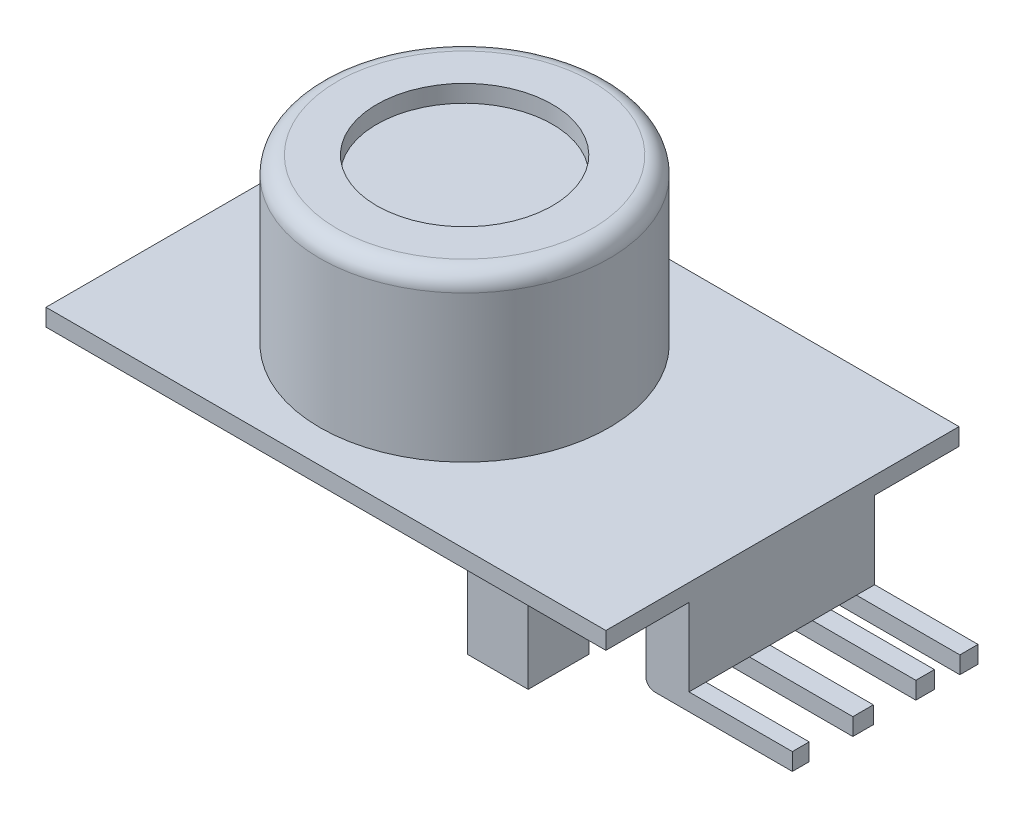
ISO-10303-21;
HEADER;
FILE_DESCRIPTION(('STEP AP214'),'2;1');
FILE_NAME('part.step','',(''),(''),'','','');
FILE_SCHEMA(('AUTOMOTIVE_DESIGN { 1 0 10303 214 1 1 1 1 }'));
ENDSEC;
DATA;
#1=APPLICATION_CONTEXT('core data for automotive mechanical design processes');
#2=APPLICATION_PROTOCOL_DEFINITION('international standard','automotive_design',2000,#1);
#3=PRODUCT_CONTEXT('',#1,'mechanical');
#4=PRODUCT('Part','Part','',(#3));
#5=PRODUCT_RELATED_PRODUCT_CATEGORY('part','',(#4));
#6=PRODUCT_DEFINITION_FORMATION('','',#4);
#7=PRODUCT_DEFINITION_CONTEXT('part definition',#1,'design');
#8=PRODUCT_DEFINITION('design','',#6,#7);
#9=PRODUCT_DEFINITION_SHAPE('','',#8);
#10=(LENGTH_UNIT() NAMED_UNIT(*) SI_UNIT(.MILLI.,.METRE.));
#11=(NAMED_UNIT(*) PLANE_ANGLE_UNIT() SI_UNIT($,.RADIAN.));
#12=(NAMED_UNIT(*) SI_UNIT($,.STERADIAN.) SOLID_ANGLE_UNIT());
#13=UNCERTAINTY_MEASURE_WITH_UNIT(LENGTH_MEASURE(1.E-05),#10,'distance_accuracy_value','');
#14=(GEOMETRIC_REPRESENTATION_CONTEXT(3) GLOBAL_UNCERTAINTY_ASSIGNED_CONTEXT((#13)) GLOBAL_UNIT_ASSIGNED_CONTEXT((#10,
#11,#12)) REPRESENTATION_CONTEXT('',''));
#15=CARTESIAN_POINT('',(0.,0.,0.));
#16=DIRECTION('',(0.,0.,1.));
#17=DIRECTION('',(1.,0.,0.));
#18=AXIS2_PLACEMENT_3D('',#15,#16,#17);
#19=CARTESIAN_POINT('',(30.,-5.5,-4.82477315597407));
#20=DIRECTION('',(1.,0.,0.));
#21=DIRECTION('',(0.,0.,-1.));
#22=AXIS2_PLACEMENT_3D('',#19,#20,#21);
#23=PLANE('',#22);
#24=DIRECTION('',(0.,1.,0.));
#25=VECTOR('',#24,1.);
#26=CARTESIAN_POINT('',(30.,-5.5,-5.80335780313983));
#27=LINE('',#26,#25);
#28=CARTESIAN_POINT('',(30.,-5.,-5.80335780313983));
#29=VERTEX_POINT('',#28);
#30=CARTESIAN_POINT('',(30.,-4.5,-5.80335780313983));
#31=VERTEX_POINT('',#30);
#32=EDGE_CURVE('E449',#29,#31,#27,.T.);
#33=ORIENTED_EDGE('',*,*,#32,.F.);
#34=DIRECTION('',(0.,0.,-1.));
#35=VECTOR('',#34,1.);
#36=CARTESIAN_POINT('',(30.,-5.,-4.82477315597407));
#37=LINE('',#36,#35);
#38=CARTESIAN_POINT('',(30.,-5.,-4.82477315597407));
#39=VERTEX_POINT('',#38);
#40=EDGE_CURVE('E372',#29,#39,#37,.F.);
#41=ORIENTED_EDGE('',*,*,#40,.T.);
#42=DIRECTION('',(0.,1.,0.));
#43=VECTOR('',#42,1.);
#44=CARTESIAN_POINT('',(30.,-5.5,-4.82477315597407));
#45=LINE('',#44,#43);
#46=CARTESIAN_POINT('',(30.,0.,-4.82477315597407));
#47=VERTEX_POINT('',#46);
#48=EDGE_CURVE('E316',#39,#47,#45,.T.);
#49=ORIENTED_EDGE('',*,*,#48,.T.);
#50=DIRECTION('',(0.,0.,-1.));
#51=VECTOR('',#50,1.);
#52=CARTESIAN_POINT('',(30.,0.,-4.82477315597407));
#53=LINE('',#52,#51);
#54=CARTESIAN_POINT('',(30.,0.,-15.6016245856563));
#55=VERTEX_POINT('',#54);
#56=EDGE_CURVE('E308',#47,#55,#53,.T.);
#57=ORIENTED_EDGE('',*,*,#56,.T.);
#58=DIRECTION('',(0.,1.,0.));
#59=VECTOR('',#58,1.);
#60=CARTESIAN_POINT('',(30.,-5.5,-15.6016245856563));
#61=LINE('',#60,#59);
#62=CARTESIAN_POINT('',(30.,-5.,-15.6016245856563));
#63=VERTEX_POINT('',#62);
#64=EDGE_CURVE('E314',#63,#55,#61,.T.);
#65=ORIENTED_EDGE('',*,*,#64,.F.);
#66=DIRECTION('',(0.,0.,-1.));
#67=VECTOR('',#66,1.);
#68=CARTESIAN_POINT('',(30.,-5.,-4.82477315597407));
#69=LINE('',#68,#67);
#70=CARTESIAN_POINT('',(30.,-5.,-14.5483695910362));
#71=VERTEX_POINT('',#70);
#72=EDGE_CURVE('E366',#63,#71,#69,.F.);
#73=ORIENTED_EDGE('',*,*,#72,.T.);
#74=DIRECTION('',(0.,1.,0.));
#75=VECTOR('',#74,1.);
#76=CARTESIAN_POINT('',(30.,-5.5,-14.5483695910362));
#77=LINE('',#76,#75);
#78=CARTESIAN_POINT('',(30.,-4.5,-14.5483695910362));
#79=VERTEX_POINT('',#78);
#80=EDGE_CURVE('E423',#71,#79,#77,.T.);
#81=ORIENTED_EDGE('',*,*,#80,.T.);
#82=DIRECTION('',(0.,0.,1.));
#83=VECTOR('',#82,1.);
#84=CARTESIAN_POINT('',(30.,-4.5,-4.82477315597407));
#85=LINE('',#84,#83);
#86=CARTESIAN_POINT('',(30.,-4.5,-13.0725111784693));
#87=VERTEX_POINT('',#86);
#88=EDGE_CURVE('E425',#79,#87,#85,.T.);
#89=ORIENTED_EDGE('',*,*,#88,.T.);
#90=DIRECTION('',(0.,-1.,0.));
#91=VECTOR('',#90,1.);
#92=CARTESIAN_POINT('',(30.,-5.5,-13.0725111784693));
#93=LINE('',#92,#91);
#94=CARTESIAN_POINT('',(30.,-5.,-13.0725111784693));
#95=VERTEX_POINT('',#94);
#96=EDGE_CURVE('E420',#87,#95,#93,.T.);
#97=ORIENTED_EDGE('',*,*,#96,.T.);
#98=DIRECTION('',(0.,0.,-1.));
#99=VECTOR('',#98,1.);
#100=CARTESIAN_POINT('',(30.,-5.,-4.82477315597407));
#101=LINE('',#100,#99);
#102=CARTESIAN_POINT('',(30.,-5.,-11.9931520409204));
#103=VERTEX_POINT('',#102);
#104=EDGE_CURVE('E368',#95,#103,#101,.F.);
#105=ORIENTED_EDGE('',*,*,#104,.T.);
#106=DIRECTION('',(0.,-1.,0.));
#107=VECTOR('',#106,1.);
#108=CARTESIAN_POINT('',(30.,-5.5,-11.9931520409204));
#109=LINE('',#108,#107);
#110=CARTESIAN_POINT('',(30.,-4.5,-11.9931520409204));
#111=VERTEX_POINT('',#110);
#112=EDGE_CURVE('E434',#111,#103,#109,.T.);
#113=ORIENTED_EDGE('',*,*,#112,.F.);
#114=DIRECTION('',(0.,0.,1.));
#115=VECTOR('',#114,1.);
#116=CARTESIAN_POINT('',(30.,-4.5,-4.82477315597407));
#117=LINE('',#116,#115);
#118=CARTESIAN_POINT('',(30.,-4.5,-9.52604544080855));
#119=VERTEX_POINT('',#118);
#120=EDGE_CURVE('E437',#111,#119,#117,.T.);
#121=ORIENTED_EDGE('',*,*,#120,.T.);
#122=DIRECTION('',(0.,-1.,0.));
#123=VECTOR('',#122,1.);
#124=CARTESIAN_POINT('',(30.,-5.5,-9.52604544080855));
#125=LINE('',#124,#123);
#126=CARTESIAN_POINT('',(30.,-5.,-9.52604544080855));
#127=VERTEX_POINT('',#126);
#128=EDGE_CURVE('E431',#119,#127,#125,.T.);
#129=ORIENTED_EDGE('',*,*,#128,.T.);
#130=DIRECTION('',(0.,0.,-1.));
#131=VECTOR('',#130,1.);
#132=CARTESIAN_POINT('',(30.,-5.,-4.82477315597407));
#133=LINE('',#132,#131);
#134=CARTESIAN_POINT('',(30.,-5.,-8.33654761575464));
#135=VERTEX_POINT('',#134);
#136=EDGE_CURVE('E370',#127,#135,#133,.F.);
#137=ORIENTED_EDGE('',*,*,#136,.T.);
#138=DIRECTION('',(0.,-1.,0.));
#139=VECTOR('',#138,1.);
#140=CARTESIAN_POINT('',(30.,-5.5,-8.33654761575464));
#141=LINE('',#140,#139);
#142=CARTESIAN_POINT('',(30.,-4.5,-8.33654761575464));
#143=VERTEX_POINT('',#142);
#144=EDGE_CURVE('E451',#143,#135,#141,.T.);
#145=ORIENTED_EDGE('',*,*,#144,.F.);
#146=DIRECTION('',(0.,0.,1.));
#147=VECTOR('',#146,1.);
#148=CARTESIAN_POINT('',(30.,-4.5,-4.82477315597407));
#149=LINE('',#148,#147);
#150=EDGE_CURVE('E443',#143,#31,#149,.T.);
#151=ORIENTED_EDGE('',*,*,#150,.T.);
#152=EDGE_LOOP('',(#33,#41,#49,#57,#65,#73,#81,#89,#97,#105,#113,#121,#129,#137,#145,#151));
#153=FACE_BOUND('',#152,.T.);
#154=ADVANCED_FACE('F33',(#153),#23,.F.);
#155=CARTESIAN_POINT('',(0.,-5.5,0.));
#156=DIRECTION('',(0.,1.,0.));
#157=DIRECTION('',(0.,0.,1.));
#158=AXIS2_PLACEMENT_3D('',#155,#156,#157);
#159=PLANE('',#158);
#160=DIRECTION('',(1.,0.,0.));
#161=VECTOR('',#160,1.);
#162=CARTESIAN_POINT('',(26.5,-5.5,-8.33654761575464));
#163=LINE('',#162,#161);
#164=CARTESIAN_POINT('',(30.5,-5.5,-8.33654761575464));
#165=VERTEX_POINT('',#164);
#166=CARTESIAN_POINT('',(38.5,-5.5,-8.33654761575464));
#167=VERTEX_POINT('',#166);
#168=EDGE_CURVE('E254',#165,#167,#163,.T.);
#169=ORIENTED_EDGE('',*,*,#168,.F.);
#170=DIRECTION('',(0.,0.,-1.));
#171=VECTOR('',#170,1.);
#172=CARTESIAN_POINT('',(30.5,-5.5,0.));
#173=LINE('',#172,#171);
#174=CARTESIAN_POINT('',(30.5,-5.5,-9.52604544080855));
#175=VERTEX_POINT('',#174);
#176=EDGE_CURVE('E376',#165,#175,#173,.T.);
#177=ORIENTED_EDGE('',*,*,#176,.T.);
#178=DIRECTION('',(1.,0.,0.));
#179=VECTOR('',#178,1.);
#180=CARTESIAN_POINT('',(26.5,-5.5,-9.52604544080855));
#181=LINE('',#180,#179);
#182=CARTESIAN_POINT('',(38.5,-5.5,-9.52604544080855));
#183=VERTEX_POINT('',#182);
#184=EDGE_CURVE('E522',#175,#183,#181,.T.);
#185=ORIENTED_EDGE('',*,*,#184,.T.);
#186=DIRECTION('',(0.,0.,-1.));
#187=VECTOR('',#186,1.);
#188=CARTESIAN_POINT('',(38.5,-5.5,-4.82477315597407));
#189=LINE('',#188,#187);
#190=EDGE_CURVE('E491',#167,#183,#189,.T.);
#191=ORIENTED_EDGE('',*,*,#190,.F.);
#192=EDGE_LOOP('',(#169,#177,#185,#191));
#193=FACE_BOUND('',#192,.T.);
#194=ADVANCED_FACE('F577',(#193),#159,.F.);
#195=DIRECTION('',(-1.,0.,0.));
#196=VECTOR('',#195,1.);
#197=CARTESIAN_POINT('',(32.5,-5.5,-4.82477315597407));
#198=LINE('',#197,#196);
#199=CARTESIAN_POINT('',(38.5,-5.5,-4.82477315597407));
#200=VERTEX_POINT('',#199);
#201=CARTESIAN_POINT('',(30.5,-5.5,-4.82477315597407));
#202=VERTEX_POINT('',#201);
#203=EDGE_CURVE('E299',#200,#202,#198,.T.);
#204=ORIENTED_EDGE('',*,*,#203,.T.);
#205=DIRECTION('',(0.,0.,-1.));
#206=VECTOR('',#205,1.);
#207=CARTESIAN_POINT('',(30.5,-5.5,0.));
#208=LINE('',#207,#206);
#209=CARTESIAN_POINT('',(30.5,-5.5,-5.80335780313983));
#210=VERTEX_POINT('',#209);
#211=EDGE_CURVE('E361',#202,#210,#208,.T.);
#212=ORIENTED_EDGE('',*,*,#211,.T.);
#213=DIRECTION('',(1.,0.,0.));
#214=VECTOR('',#213,1.);
#215=CARTESIAN_POINT('',(26.5,-5.5,-5.80335780313983));
#216=LINE('',#215,#214);
#217=CARTESIAN_POINT('',(38.5,-5.5,-5.80335780313983));
#218=VERTEX_POINT('',#217);
#219=EDGE_CURVE('E533',#210,#218,#216,.T.);
#220=ORIENTED_EDGE('',*,*,#219,.T.);
#221=EDGE_CURVE('E489',#200,#218,#189,.T.);
#222=ORIENTED_EDGE('',*,*,#221,.F.);
#223=EDGE_LOOP('',(#204,#212,#220,#222));
#224=FACE_BOUND('',#223,.T.);
#225=ADVANCED_FACE('F554',(#224),#159,.F.);
#226=DIRECTION('',(1.,0.,0.));
#227=VECTOR('',#226,1.);
#228=CARTESIAN_POINT('',(26.5,-5.5,-11.9931520409204));
#229=LINE('',#228,#227);
#230=CARTESIAN_POINT('',(30.5,-5.5,-11.9931520409204));
#231=VERTEX_POINT('',#230);
#232=CARTESIAN_POINT('',(38.5,-5.5,-11.9931520409204));
#233=VERTEX_POINT('',#232);
#234=EDGE_CURVE('E510',#231,#233,#229,.T.);
#235=ORIENTED_EDGE('',*,*,#234,.F.);
#236=DIRECTION('',(0.,0.,-1.));
#237=VECTOR('',#236,1.);
#238=CARTESIAN_POINT('',(30.5,-5.5,0.));
#239=LINE('',#238,#237);
#240=CARTESIAN_POINT('',(30.5,-5.5,-13.0725111784693));
#241=VERTEX_POINT('',#240);
#242=EDGE_CURVE('E383',#231,#241,#239,.T.);
#243=ORIENTED_EDGE('',*,*,#242,.T.);
#244=DIRECTION('',(1.,0.,0.));
#245=VECTOR('',#244,1.);
#246=CARTESIAN_POINT('',(26.5,-5.5,-13.0725111784693));
#247=LINE('',#246,#245);
#248=CARTESIAN_POINT('',(38.5,-5.5,-13.0725111784693));
#249=VERTEX_POINT('',#248);
#250=EDGE_CURVE('E408',#241,#249,#247,.T.);
#251=ORIENTED_EDGE('',*,*,#250,.T.);
#252=EDGE_CURVE('E495',#233,#249,#189,.T.);
#253=ORIENTED_EDGE('',*,*,#252,.F.);
#254=EDGE_LOOP('',(#235,#243,#251,#253));
#255=FACE_BOUND('',#254,.T.);
#256=ADVANCED_FACE('F509',(#255),#159,.F.);
#257=DIRECTION('',(1.,0.,0.));
#258=VECTOR('',#257,1.);
#259=CARTESIAN_POINT('',(26.5,-5.5,-14.5483695910362));
#260=LINE('',#259,#258);
#261=CARTESIAN_POINT('',(30.5,-5.5,-14.5483695910362));
#262=VERTEX_POINT('',#261);
#263=CARTESIAN_POINT('',(38.5,-5.5,-14.5483695910362));
#264=VERTEX_POINT('',#263);
#265=EDGE_CURVE('E404',#262,#264,#260,.T.);
#266=ORIENTED_EDGE('',*,*,#265,.F.);
#267=DIRECTION('',(0.,0.,-1.));
#268=VECTOR('',#267,1.);
#269=CARTESIAN_POINT('',(30.5,-5.5,0.));
#270=LINE('',#269,#268);
#271=CARTESIAN_POINT('',(30.5,-5.5,-15.6016245856563));
#272=VERTEX_POINT('',#271);
#273=EDGE_CURVE('E390',#262,#272,#270,.T.);
#274=ORIENTED_EDGE('',*,*,#273,.T.);
#275=DIRECTION('',(1.,0.,0.));
#276=VECTOR('',#275,1.);
#277=CARTESIAN_POINT('',(32.5,-5.5,-15.6016245856563));
#278=LINE('',#277,#276);
#279=CARTESIAN_POINT('',(38.5,-5.5,-15.6016245856563));
#280=VERTEX_POINT('',#279);
#281=EDGE_CURVE('E302',#272,#280,#278,.T.);
#282=ORIENTED_EDGE('',*,*,#281,.T.);
#283=EDGE_CURVE('E405',#264,#280,#189,.T.);
#284=ORIENTED_EDGE('',*,*,#283,.F.);
#285=EDGE_LOOP('',(#266,#274,#282,#284));
#286=FACE_BOUND('',#285,.T.);
#287=ADVANCED_FACE('F401',(#286),#159,.F.);
#288=CARTESIAN_POINT('',(38.5,-4.5,-4.82477315597407));
#289=DIRECTION('',(0.,-1.,0.));
#290=DIRECTION('',(0.,0.,-1.));
#291=AXIS2_PLACEMENT_3D('',#288,#289,#290);
#292=PLANE('',#291);
#293=DIRECTION('',(1.,0.,0.));
#294=VECTOR('',#293,1.);
#295=CARTESIAN_POINT('',(26.5,-4.5,-8.33654761575464));
#296=LINE('',#295,#294);
#297=CARTESIAN_POINT('',(32.5,-4.5,-8.33654761575464));
#298=VERTEX_POINT('',#297);
#299=CARTESIAN_POINT('',(38.5,-4.5,-8.33654761575464));
#300=VERTEX_POINT('',#299);
#301=EDGE_CURVE('E251',#298,#300,#296,.T.);
#302=ORIENTED_EDGE('',*,*,#301,.T.);
#303=DIRECTION('',(0.,0.,1.));
#304=VECTOR('',#303,1.);
#305=CARTESIAN_POINT('',(38.5,-4.5,-4.82477315597407));
#306=LINE('',#305,#304);
#307=CARTESIAN_POINT('',(38.5,-4.5,-9.52604544080855));
#308=VERTEX_POINT('',#307);
#309=EDGE_CURVE('E267',#308,#300,#306,.T.);
#310=ORIENTED_EDGE('',*,*,#309,.F.);
#311=DIRECTION('',(1.,0.,0.));
#312=VECTOR('',#311,1.);
#313=CARTESIAN_POINT('',(26.5,-4.5,-9.52604544080855));
#314=LINE('',#313,#312);
#315=CARTESIAN_POINT('',(32.5,-4.5,-9.52604544080855));
#316=VERTEX_POINT('',#315);
#317=EDGE_CURVE('E519',#316,#308,#314,.T.);
#318=ORIENTED_EDGE('',*,*,#317,.F.);
#319=DIRECTION('',(0.,0.,1.));
#320=VECTOR('',#319,1.);
#321=CARTESIAN_POINT('',(32.5,-4.5,-4.82477315597407));
#322=LINE('',#321,#320);
#323=EDGE_CURVE('E269',#316,#298,#322,.T.);
#324=ORIENTED_EDGE('',*,*,#323,.T.);
#325=EDGE_LOOP('',(#302,#310,#318,#324));
#326=FACE_BOUND('',#325,.T.);
#327=ADVANCED_FACE('F265',(#326),#292,.F.);
#328=DIRECTION('',(1.,0.,0.));
#329=VECTOR('',#328,1.);
#330=CARTESIAN_POINT('',(26.5,-4.5,-5.80335780313983));
#331=LINE('',#330,#329);
#332=CARTESIAN_POINT('',(32.5,-4.5,-5.80335780313983));
#333=VERTEX_POINT('',#332);
#334=CARTESIAN_POINT('',(38.5,-4.5,-5.80335780313983));
#335=VERTEX_POINT('',#334);
#336=EDGE_CURVE('E530',#333,#335,#331,.T.);
#337=ORIENTED_EDGE('',*,*,#336,.F.);
#338=CARTESIAN_POINT('',(32.5,-4.5,-4.82477315597407));
#339=VERTEX_POINT('',#338);
#340=EDGE_CURVE('E292',#333,#339,#322,.T.);
#341=ORIENTED_EDGE('',*,*,#340,.T.);
#342=DIRECTION('',(-1.,0.,0.));
#343=VECTOR('',#342,1.);
#344=CARTESIAN_POINT('',(38.5,-4.5,-4.82477315597407));
#345=LINE('',#344,#343);
#346=CARTESIAN_POINT('',(38.5,-4.5,-4.82477315597407));
#347=VERTEX_POINT('',#346);
#348=EDGE_CURVE('E285',#347,#339,#345,.T.);
#349=ORIENTED_EDGE('',*,*,#348,.F.);
#350=EDGE_CURVE('E277',#335,#347,#306,.T.);
#351=ORIENTED_EDGE('',*,*,#350,.F.);
#352=EDGE_LOOP('',(#337,#341,#349,#351));
#353=FACE_BOUND('',#352,.T.);
#354=ADVANCED_FACE('F544',(#353),#292,.F.);
#355=DIRECTION('',(1.,0.,0.));
#356=VECTOR('',#355,1.);
#357=CARTESIAN_POINT('',(26.5,-4.5,-11.9931520409204));
#358=LINE('',#357,#356);
#359=CARTESIAN_POINT('',(32.5,-4.5,-11.9931520409204));
#360=VERTEX_POINT('',#359);
#361=CARTESIAN_POINT('',(38.5,-4.5,-11.9931520409204));
#362=VERTEX_POINT('',#361);
#363=EDGE_CURVE('E525',#360,#362,#358,.T.);
#364=ORIENTED_EDGE('',*,*,#363,.T.);
#365=CARTESIAN_POINT('',(38.5,-4.5,-13.0725111784693));
#366=VERTEX_POINT('',#365);
#367=EDGE_CURVE('E276',#366,#362,#306,.T.);
#368=ORIENTED_EDGE('',*,*,#367,.F.);
#369=DIRECTION('',(1.,0.,0.));
#370=VECTOR('',#369,1.);
#371=CARTESIAN_POINT('',(26.5,-4.5,-13.0725111784693));
#372=LINE('',#371,#370);
#373=CARTESIAN_POINT('',(32.5,-4.5,-13.0725111784693));
#374=VERTEX_POINT('',#373);
#375=EDGE_CURVE('E417',#374,#366,#372,.T.);
#376=ORIENTED_EDGE('',*,*,#375,.F.);
#377=EDGE_CURVE('E291',#374,#360,#322,.T.);
#378=ORIENTED_EDGE('',*,*,#377,.T.);
#379=EDGE_LOOP('',(#364,#368,#376,#378));
#380=FACE_BOUND('',#379,.T.);
#381=ADVANCED_FACE('F676',(#380),#292,.F.);
#382=CARTESIAN_POINT('',(32.5,-4.5,-15.6016245856563));
#383=VERTEX_POINT('',#382);
#384=CARTESIAN_POINT('',(32.5,-4.5,-14.5483695910362));
#385=VERTEX_POINT('',#384);
#386=EDGE_CURVE('E287',#383,#385,#322,.T.);
#387=ORIENTED_EDGE('',*,*,#386,.T.);
#388=DIRECTION('',(1.,0.,0.));
#389=VECTOR('',#388,1.);
#390=CARTESIAN_POINT('',(26.5,-4.5,-14.5483695910362));
#391=LINE('',#390,#389);
#392=CARTESIAN_POINT('',(38.5,-4.5,-14.5483695910362));
#393=VERTEX_POINT('',#392);
#394=EDGE_CURVE('E407',#385,#393,#391,.T.);
#395=ORIENTED_EDGE('',*,*,#394,.T.);
#396=CARTESIAN_POINT('',(38.5,-4.5,-15.6016245856563));
#397=VERTEX_POINT('',#396);
#398=EDGE_CURVE('E280',#397,#393,#306,.T.);
#399=ORIENTED_EDGE('',*,*,#398,.F.);
#400=DIRECTION('',(-1.,0.,0.));
#401=VECTOR('',#400,1.);
#402=CARTESIAN_POINT('',(38.5,-4.5,-15.6016245856563));
#403=LINE('',#402,#401);
#404=EDGE_CURVE('E295',#397,#383,#403,.T.);
#405=ORIENTED_EDGE('',*,*,#404,.T.);
#406=EDGE_LOOP('',(#387,#395,#399,#405));
#407=FACE_BOUND('',#406,.T.);
#408=ADVANCED_FACE('F670',(#407),#292,.F.);
#409=CARTESIAN_POINT('',(38.5,0.,0.));
#410=DIRECTION('',(-1.,0.,0.));
#411=DIRECTION('',(0.,0.,1.));
#412=AXIS2_PLACEMENT_3D('',#409,#410,#411);
#413=PLANE('',#412);
#414=DIRECTION('',(0.,-1.,0.));
#415=VECTOR('',#414,1.);
#416=CARTESIAN_POINT('',(38.5,0.,-8.33654761575464));
#417=LINE('',#416,#415);
#418=EDGE_CURVE('E246',#300,#167,#417,.T.);
#419=ORIENTED_EDGE('',*,*,#418,.T.);
#420=ORIENTED_EDGE('',*,*,#190,.T.);
#421=DIRECTION('',(0.,-1.,0.));
#422=VECTOR('',#421,1.);
#423=CARTESIAN_POINT('',(38.5,0.,-9.52604544080855));
#424=LINE('',#423,#422);
#425=EDGE_CURVE('E275',#308,#183,#424,.T.);
#426=ORIENTED_EDGE('',*,*,#425,.F.);
#427=ORIENTED_EDGE('',*,*,#309,.T.);
#428=EDGE_LOOP('',(#419,#420,#426,#427));
#429=FACE_BOUND('',#428,.T.);
#430=ADVANCED_FACE('F273',(#429),#413,.F.);
#431=DIRECTION('',(0.,1.,0.));
#432=VECTOR('',#431,1.);
#433=CARTESIAN_POINT('',(38.5,0.,-5.80335780313983));
#434=LINE('',#433,#432);
#435=EDGE_CURVE('E259',#218,#335,#434,.T.);
#436=ORIENTED_EDGE('',*,*,#435,.T.);
#437=ORIENTED_EDGE('',*,*,#350,.T.);
#438=DIRECTION('',(0.,-1.,0.));
#439=VECTOR('',#438,1.);
#440=CARTESIAN_POINT('',(38.5,-5.5,-4.82477315597407));
#441=LINE('',#440,#439);
#442=EDGE_CURVE('E290',#347,#200,#441,.T.);
#443=ORIENTED_EDGE('',*,*,#442,.T.);
#444=ORIENTED_EDGE('',*,*,#221,.T.);
#445=EDGE_LOOP('',(#436,#437,#443,#444));
#446=FACE_BOUND('',#445,.T.);
#447=ADVANCED_FACE('F538',(#446),#413,.F.);
#448=DIRECTION('',(0.,-1.,0.));
#449=VECTOR('',#448,1.);
#450=CARTESIAN_POINT('',(38.5,0.,-11.9931520409204));
#451=LINE('',#450,#449);
#452=EDGE_CURVE('E506',#362,#233,#451,.T.);
#453=ORIENTED_EDGE('',*,*,#452,.T.);
#454=ORIENTED_EDGE('',*,*,#252,.T.);
#455=DIRECTION('',(0.,-1.,0.));
#456=VECTOR('',#455,1.);
#457=CARTESIAN_POINT('',(38.5,0.,-13.0725111784693));
#458=LINE('',#457,#456);
#459=EDGE_CURVE('E504',#366,#249,#458,.T.);
#460=ORIENTED_EDGE('',*,*,#459,.F.);
#461=ORIENTED_EDGE('',*,*,#367,.T.);
#462=EDGE_LOOP('',(#453,#454,#460,#461));
#463=FACE_BOUND('',#462,.T.);
#464=ADVANCED_FACE('F502',(#463),#413,.F.);
#465=ORIENTED_EDGE('',*,*,#398,.T.);
#466=DIRECTION('',(0.,1.,0.));
#467=VECTOR('',#466,1.);
#468=CARTESIAN_POINT('',(38.5,0.,-14.5483695910362));
#469=LINE('',#468,#467);
#470=EDGE_CURVE('E419',#264,#393,#469,.T.);
#471=ORIENTED_EDGE('',*,*,#470,.F.);
#472=ORIENTED_EDGE('',*,*,#283,.T.);
#473=DIRECTION('',(0.,1.,0.));
#474=VECTOR('',#473,1.);
#475=CARTESIAN_POINT('',(38.5,-5.5,-15.6016245856563));
#476=LINE('',#475,#474);
#477=EDGE_CURVE('E281',#280,#397,#476,.T.);
#478=ORIENTED_EDGE('',*,*,#477,.T.);
#479=EDGE_LOOP('',(#465,#471,#472,#478));
#480=FACE_BOUND('',#479,.T.);
#481=ADVANCED_FACE('F605',(#480),#413,.F.);
#482=CARTESIAN_POINT('',(0.,0.,0.));
#483=DIRECTION('',(0.,-1.,0.));
#484=DIRECTION('',(0.,0.,-1.));
#485=AXIS2_PLACEMENT_3D('',#482,#483,#484);
#486=PLANE('',#485);
#487=DIRECTION('',(1.,0.,0.));
#488=VECTOR('',#487,1.);
#489=CARTESIAN_POINT('',(32.5,0.,-15.6016245856563));
#490=LINE('',#489,#488);
#491=CARTESIAN_POINT('',(32.5,0.,-15.6016245856563));
#492=VERTEX_POINT('',#491);
#493=EDGE_CURVE('E303',#55,#492,#490,.T.);
#494=ORIENTED_EDGE('',*,*,#493,.F.);
#495=ORIENTED_EDGE('',*,*,#56,.F.);
#496=DIRECTION('',(-1.,0.,0.));
#497=VECTOR('',#496,1.);
#498=CARTESIAN_POINT('',(32.5,0.,-4.82477315597407));
#499=LINE('',#498,#497);
#500=CARTESIAN_POINT('',(32.5,0.,-4.82477315597407));
#501=VERTEX_POINT('',#500);
#502=EDGE_CURVE('E298',#501,#47,#499,.T.);
#503=ORIENTED_EDGE('',*,*,#502,.F.);
#504=DIRECTION('',(0.,0.,-1.));
#505=VECTOR('',#504,1.);
#506=CARTESIAN_POINT('',(32.5,0.,0.));
#507=LINE('',#506,#505);
#508=CARTESIAN_POINT('',(32.5,0.,0.));
#509=VERTEX_POINT('',#508);
#510=EDGE_CURVE('E342',#509,#501,#507,.T.);
#511=ORIENTED_EDGE('',*,*,#510,.F.);
#512=DIRECTION('',(1.,0.,0.));
#513=VECTOR('',#512,1.);
#514=CARTESIAN_POINT('',(0.,0.,0.));
#515=LINE('',#514,#513);
#516=CARTESIAN_POINT('',(0.,0.,0.));
#517=VERTEX_POINT('',#516);
#518=EDGE_CURVE('E339',#517,#509,#515,.T.);
#519=ORIENTED_EDGE('',*,*,#518,.F.);
#520=DIRECTION('',(0.,0.,1.));
#521=VECTOR('',#520,1.);
#522=CARTESIAN_POINT('',(0.,0.,0.));
#523=LINE('',#522,#521);
#524=CARTESIAN_POINT('',(0.,0.,-20.5));
#525=VERTEX_POINT('',#524);
#526=EDGE_CURVE('E320',#525,#517,#523,.T.);
#527=ORIENTED_EDGE('',*,*,#526,.F.);
#528=DIRECTION('',(-1.,0.,0.));
#529=VECTOR('',#528,1.);
#530=CARTESIAN_POINT('',(0.,0.,-20.5));
#531=LINE('',#530,#529);
#532=CARTESIAN_POINT('',(32.5,0.,-20.5));
#533=VERTEX_POINT('',#532);
#534=EDGE_CURVE('E330',#533,#525,#531,.T.);
#535=ORIENTED_EDGE('',*,*,#534,.F.);
#536=EDGE_CURVE('E341',#492,#533,#507,.T.);
#537=ORIENTED_EDGE('',*,*,#536,.F.);
#538=EDGE_LOOP('',(#494,#495,#503,#511,#519,#527,#535,#537));
#539=FACE_BOUND('',#538,.T.);
#540=DIRECTION('',(1.,0.,0.));
#541=VECTOR('',#540,1.);
#542=CARTESIAN_POINT('',(23.6701650281233,0.,-4.31961192060122));
#543=LINE('',#542,#541);
#544=CARTESIAN_POINT('',(23.6701650281233,0.,-4.31961192060122));
#545=VERTEX_POINT('',#544);
#546=CARTESIAN_POINT('',(27.2062970506219,0.,-4.31961192060122));
#547=VERTEX_POINT('',#546);
#548=EDGE_CURVE('E473',#545,#547,#543,.T.);
#549=ORIENTED_EDGE('',*,*,#548,.F.);
#550=DIRECTION('',(0.,0.,-1.));
#551=VECTOR('',#550,1.);
#552=CARTESIAN_POINT('',(23.6701650281233,0.,-0.783479898102573));
#553=LINE('',#552,#551);
#554=CARTESIAN_POINT('',(23.6701650281233,0.,-0.783479898102573));
#555=VERTEX_POINT('',#554);
#556=EDGE_CURVE('E457',#555,#545,#553,.T.);
#557=ORIENTED_EDGE('',*,*,#556,.F.);
#558=DIRECTION('',(-1.,0.,0.));
#559=VECTOR('',#558,1.);
#560=CARTESIAN_POINT('',(23.6701650281233,0.,-0.783479898102573));
#561=LINE('',#560,#559);
#562=CARTESIAN_POINT('',(27.2062970506219,0.,-0.783479898102573));
#563=VERTEX_POINT('',#562);
#564=EDGE_CURVE('E464',#563,#555,#561,.T.);
#565=ORIENTED_EDGE('',*,*,#564,.F.);
#566=DIRECTION('',(0.,0.,1.));
#567=VECTOR('',#566,1.);
#568=CARTESIAN_POINT('',(27.2062970506219,0.,-0.783479898102573));
#569=LINE('',#568,#567);
#570=EDGE_CURVE('E475',#547,#563,#569,.T.);
#571=ORIENTED_EDGE('',*,*,#570,.F.);
#572=EDGE_LOOP('',(#549,#557,#565,#571));
#573=FACE_BOUND('',#572,.T.);
#574=ADVANCED_FACE('F601',(#539,#573),#486,.T.);
#575=CARTESIAN_POINT('',(32.5,1.,0.));
#576=DIRECTION('',(-1.,0.,0.));
#577=DIRECTION('',(0.,0.,1.));
#578=AXIS2_PLACEMENT_3D('',#575,#576,#577);
#579=PLANE('',#578);
#580=ORIENTED_EDGE('',*,*,#386,.F.);
#581=DIRECTION('',(0.,1.,0.));
#582=VECTOR('',#581,1.);
#583=CARTESIAN_POINT('',(32.5,-5.5,-15.6016245856563));
#584=LINE('',#583,#582);
#585=EDGE_CURVE('E305',#383,#492,#584,.T.);
#586=ORIENTED_EDGE('',*,*,#585,.T.);
#587=ORIENTED_EDGE('',*,*,#536,.T.);
#588=DIRECTION('',(0.,-1.,0.));
#589=VECTOR('',#588,1.);
#590=CARTESIAN_POINT('',(32.5,1.,-20.5));
#591=LINE('',#590,#589);
#592=CARTESIAN_POINT('',(32.5,1.,-20.5));
#593=VERTEX_POINT('',#592);
#594=EDGE_CURVE('E348',#593,#533,#591,.T.);
#595=ORIENTED_EDGE('',*,*,#594,.F.);
#596=DIRECTION('',(0.,0.,-1.));
#597=VECTOR('',#596,1.);
#598=CARTESIAN_POINT('',(32.5,1.,0.));
#599=LINE('',#598,#597);
#600=CARTESIAN_POINT('',(32.5,1.,0.));
#601=VERTEX_POINT('',#600);
#602=EDGE_CURVE('E332',#601,#593,#599,.T.);
#603=ORIENTED_EDGE('',*,*,#602,.F.);
#604=DIRECTION('',(0.,-1.,0.));
#605=VECTOR('',#604,1.);
#606=CARTESIAN_POINT('',(32.5,1.,0.));
#607=LINE('',#606,#605);
#608=EDGE_CURVE('E351',#601,#509,#607,.T.);
#609=ORIENTED_EDGE('',*,*,#608,.T.);
#610=ORIENTED_EDGE('',*,*,#510,.T.);
#611=DIRECTION('',(0.,1.,0.));
#612=VECTOR('',#611,1.);
#613=CARTESIAN_POINT('',(32.5,-5.5,-4.82477315597407));
#614=LINE('',#613,#612);
#615=EDGE_CURVE('E318',#339,#501,#614,.T.);
#616=ORIENTED_EDGE('',*,*,#615,.F.);
#617=ORIENTED_EDGE('',*,*,#340,.F.);
#618=DIRECTION('',(0.,0.,-1.));
#619=VECTOR('',#618,1.);
#620=CARTESIAN_POINT('',(32.5,-4.5,0.));
#621=LINE('',#620,#619);
#622=EDGE_CURVE('E446',#333,#298,#621,.T.);
#623=ORIENTED_EDGE('',*,*,#622,.T.);
#624=ORIENTED_EDGE('',*,*,#323,.F.);
#625=DIRECTION('',(0.,0.,-1.));
#626=VECTOR('',#625,1.);
#627=CARTESIAN_POINT('',(32.5,-4.5,0.));
#628=LINE('',#627,#626);
#629=EDGE_CURVE('E440',#316,#360,#628,.T.);
#630=ORIENTED_EDGE('',*,*,#629,.T.);
#631=ORIENTED_EDGE('',*,*,#377,.F.);
#632=DIRECTION('',(0.,0.,-1.));
#633=VECTOR('',#632,1.);
#634=CARTESIAN_POINT('',(32.5,-4.5,0.));
#635=LINE('',#634,#633);
#636=EDGE_CURVE('E428',#374,#385,#635,.T.);
#637=ORIENTED_EDGE('',*,*,#636,.T.);
#638=EDGE_LOOP('',(#580,#586,#587,#595,#603,#609,#610,#616,#617,#623,#624,#630,#631,#637));
#639=FACE_BOUND('',#638,.T.);
#640=ADVANCED_FACE('F604',(#639),#579,.F.);
#641=CARTESIAN_POINT('',(0.,1.,0.));
#642=DIRECTION('',(1.,0.,0.));
#643=DIRECTION('',(0.,0.,-1.));
#644=AXIS2_PLACEMENT_3D('',#641,#642,#643);
#645=PLANE('',#644);
#646=ORIENTED_EDGE('',*,*,#526,.T.);
#647=DIRECTION('',(0.,-1.,0.));
#648=VECTOR('',#647,1.);
#649=CARTESIAN_POINT('',(0.,1.,0.));
#650=LINE('',#649,#648);
#651=CARTESIAN_POINT('',(0.,1.,0.));
#652=VERTEX_POINT('',#651);
#653=EDGE_CURVE('E325',#652,#517,#650,.T.);
#654=ORIENTED_EDGE('',*,*,#653,.F.);
#655=DIRECTION('',(0.,0.,1.));
#656=VECTOR('',#655,1.);
#657=CARTESIAN_POINT('',(0.,1.,0.));
#658=LINE('',#657,#656);
#659=CARTESIAN_POINT('',(0.,1.,-20.5));
#660=VERTEX_POINT('',#659);
#661=EDGE_CURVE('E326',#660,#652,#658,.T.);
#662=ORIENTED_EDGE('',*,*,#661,.F.);
#663=DIRECTION('',(0.,-1.,0.));
#664=VECTOR('',#663,1.);
#665=CARTESIAN_POINT('',(0.,1.,-20.5));
#666=LINE('',#665,#664);
#667=EDGE_CURVE('E336',#660,#525,#666,.T.);
#668=ORIENTED_EDGE('',*,*,#667,.T.);
#669=EDGE_LOOP('',(#646,#654,#662,#668));
#670=FACE_BOUND('',#669,.T.);
#671=ADVANCED_FACE('F613',(#670),#645,.F.);
#672=CARTESIAN_POINT('',(0.,1.,0.));
#673=DIRECTION('',(0.,0.,-1.));
#674=DIRECTION('',(-1.,0.,0.));
#675=AXIS2_PLACEMENT_3D('',#672,#673,#674);
#676=PLANE('',#675);
#677=ORIENTED_EDGE('',*,*,#518,.T.);
#678=ORIENTED_EDGE('',*,*,#608,.F.);
#679=DIRECTION('',(1.,0.,0.));
#680=VECTOR('',#679,1.);
#681=CARTESIAN_POINT('',(0.,1.,0.));
#682=LINE('',#681,#680);
#683=EDGE_CURVE('E329',#652,#601,#682,.T.);
#684=ORIENTED_EDGE('',*,*,#683,.F.);
#685=ORIENTED_EDGE('',*,*,#653,.T.);
#686=EDGE_LOOP('',(#677,#678,#684,#685));
#687=FACE_BOUND('',#686,.T.);
#688=ADVANCED_FACE('F609',(#687),#676,.F.);
#689=CARTESIAN_POINT('',(0.,1.,-20.5));
#690=DIRECTION('',(0.,0.,1.));
#691=DIRECTION('',(1.,0.,0.));
#692=AXIS2_PLACEMENT_3D('',#689,#690,#691);
#693=PLANE('',#692);
#694=ORIENTED_EDGE('',*,*,#534,.T.);
#695=ORIENTED_EDGE('',*,*,#667,.F.);
#696=DIRECTION('',(-1.,0.,0.));
#697=VECTOR('',#696,1.);
#698=CARTESIAN_POINT('',(0.,1.,-20.5));
#699=LINE('',#698,#697);
#700=EDGE_CURVE('E334',#593,#660,#699,.T.);
#701=ORIENTED_EDGE('',*,*,#700,.F.);
#702=ORIENTED_EDGE('',*,*,#594,.T.);
#703=EDGE_LOOP('',(#694,#695,#701,#702));
#704=FACE_BOUND('',#703,.T.);
#705=ADVANCED_FACE('F599',(#704),#693,.F.);
#706=CARTESIAN_POINT('',(0.,1.,0.));
#707=DIRECTION('',(0.,-1.,0.));
#708=DIRECTION('',(0.,0.,-1.));
#709=AXIS2_PLACEMENT_3D('',#706,#707,#708);
#710=PLANE('',#709);
#711=CARTESIAN_POINT('',(14.,1.,-10.3));
#712=DIRECTION('',(0.,1.,0.));
#713=DIRECTION('',(0.,0.,1.));
#714=AXIS2_PLACEMENT_3D('',#711,#712,#713);
#715=CIRCLE('',#714,8.4);
#716=CARTESIAN_POINT('',(14.,1.,-1.9));
#717=VERTEX_POINT('',#716);
#718=EDGE_CURVE('E321',#717,#717,#715,.T.);
#719=ORIENTED_EDGE('',*,*,#718,.F.);
#720=EDGE_LOOP('',(#719));
#721=FACE_BOUND('',#720,.T.);
#722=ORIENTED_EDGE('',*,*,#661,.T.);
#723=ORIENTED_EDGE('',*,*,#683,.T.);
#724=ORIENTED_EDGE('',*,*,#602,.T.);
#725=ORIENTED_EDGE('',*,*,#700,.T.);
#726=EDGE_LOOP('',(#722,#723,#724,#725));
#727=FACE_BOUND('',#726,.T.);
#728=ADVANCED_FACE('F595',(#721,#727),#710,.F.);
#729=CARTESIAN_POINT('',(14.,10.5,-10.3));
#730=DIRECTION('',(0.,-1.,0.));
#731=DIRECTION('',(0.,0.,-1.));
#732=AXIS2_PLACEMENT_3D('',#729,#730,#731);
#733=CYLINDRICAL_SURFACE('',#732,8.4);
#734=CARTESIAN_POINT('',(14.,9.5,-10.3));
#735=DIRECTION('',(0.,1.,0.));
#736=DIRECTION('',(0.,0.,1.));
#737=AXIS2_PLACEMENT_3D('',#734,#735,#736);
#738=CIRCLE('',#737,8.4);
#739=CARTESIAN_POINT('',(14.,9.5,-1.9));
#740=VERTEX_POINT('',#739);
#741=EDGE_CURVE('E358',#740,#740,#738,.F.);
#742=ORIENTED_EDGE('',*,*,#741,.T.);
#743=EDGE_LOOP('',(#742));
#744=FACE_BOUND('',#743,.T.);
#745=ORIENTED_EDGE('',*,*,#718,.T.);
#746=EDGE_LOOP('',(#745));
#747=FACE_BOUND('',#746,.T.);
#748=ADVANCED_FACE('F591',(#744,#747),#733,.T.);
#749=CARTESIAN_POINT('',(14.,10.5,-10.3));
#750=DIRECTION('',(0.,1.,0.));
#751=DIRECTION('',(0.,0.,1.));
#752=AXIS2_PLACEMENT_3D('',#749,#750,#751);
#753=PLANE('',#752);
#754=CARTESIAN_POINT('',(14.,10.5,-10.3));
#755=DIRECTION('',(0.,1.,0.));
#756=DIRECTION('',(0.,0.,1.));
#757=AXIS2_PLACEMENT_3D('',#754,#755,#756);
#758=CIRCLE('',#757,7.4);
#759=CARTESIAN_POINT('',(14.,10.5,-2.9));
#760=VERTEX_POINT('',#759);
#761=EDGE_CURVE('E324',#760,#760,#758,.T.);
#762=ORIENTED_EDGE('',*,*,#761,.T.);
#763=EDGE_LOOP('',(#762));
#764=FACE_BOUND('',#763,.T.);
#765=CARTESIAN_POINT('',(14.,10.5,-10.3));
#766=DIRECTION('',(0.,1.,0.));
#767=DIRECTION('',(0.,0.,1.));
#768=AXIS2_PLACEMENT_3D('',#765,#766,#767);
#769=CIRCLE('',#768,5.1);
#770=CARTESIAN_POINT('',(14.,10.5,-5.2));
#771=VERTEX_POINT('',#770);
#772=EDGE_CURVE('E453',#771,#771,#769,.T.);
#773=ORIENTED_EDGE('',*,*,#772,.F.);
#774=EDGE_LOOP('',(#773));
#775=FACE_BOUND('',#774,.T.);
#776=ADVANCED_FACE('F588',(#764,#775),#753,.T.);
#777=CARTESIAN_POINT('',(32.5,-5.5,-4.82477315597407));
#778=DIRECTION('',(0.,0.,-1.));
#779=DIRECTION('',(-1.,0.,0.));
#780=AXIS2_PLACEMENT_3D('',#777,#778,#779);
#781=PLANE('',#780);
#782=ORIENTED_EDGE('',*,*,#48,.F.);
#783=CARTESIAN_POINT('',(30.5,-5.,-4.82477315597407));
#784=DIRECTION('',(0.,0.,-1.));
#785=DIRECTION('',(-1.,0.,0.));
#786=AXIS2_PLACEMENT_3D('',#783,#784,#785);
#787=CIRCLE('',#786,0.5);
#788=EDGE_CURVE('E374',#39,#202,#787,.F.);
#789=ORIENTED_EDGE('',*,*,#788,.T.);
#790=ORIENTED_EDGE('',*,*,#203,.F.);
#791=ORIENTED_EDGE('',*,*,#442,.F.);
#792=ORIENTED_EDGE('',*,*,#348,.T.);
#793=ORIENTED_EDGE('',*,*,#615,.T.);
#794=ORIENTED_EDGE('',*,*,#502,.T.);
#795=EDGE_LOOP('',(#782,#789,#790,#791,#792,#793,#794));
#796=FACE_BOUND('',#795,.T.);
#797=ADVANCED_FACE('F550',(#796),#781,.F.);
#798=CARTESIAN_POINT('',(32.5,-5.5,-15.6016245856563));
#799=DIRECTION('',(0.,0.,1.));
#800=DIRECTION('',(1.,0.,0.));
#801=AXIS2_PLACEMENT_3D('',#798,#799,#800);
#802=PLANE('',#801);
#803=ORIENTED_EDGE('',*,*,#281,.F.);
#804=CARTESIAN_POINT('',(30.5,-5.,-15.6016245856563));
#805=DIRECTION('',(0.,0.,1.));
#806=DIRECTION('',(1.,0.,0.));
#807=AXIS2_PLACEMENT_3D('',#804,#805,#806);
#808=CIRCLE('',#807,0.5);
#809=EDGE_CURVE('E41',#272,#63,#808,.F.);
#810=ORIENTED_EDGE('',*,*,#809,.T.);
#811=ORIENTED_EDGE('',*,*,#64,.T.);
#812=ORIENTED_EDGE('',*,*,#493,.T.);
#813=ORIENTED_EDGE('',*,*,#585,.F.);
#814=ORIENTED_EDGE('',*,*,#404,.F.);
#815=ORIENTED_EDGE('',*,*,#477,.F.);
#816=EDGE_LOOP('',(#803,#810,#811,#812,#813,#814,#815));
#817=FACE_BOUND('',#816,.T.);
#818=ADVANCED_FACE('F394',(#817),#802,.F.);
#819=CARTESIAN_POINT('',(23.6701650281233,-5.,-0.783479898102573));
#820=DIRECTION('',(1.,0.,0.));
#821=DIRECTION('',(0.,0.,-1.));
#822=AXIS2_PLACEMENT_3D('',#819,#820,#821);
#823=PLANE('',#822);
#824=ORIENTED_EDGE('',*,*,#556,.T.);
#825=DIRECTION('',(0.,1.,0.));
#826=VECTOR('',#825,1.);
#827=CARTESIAN_POINT('',(23.6701650281233,-5.,-4.31961192060122));
#828=LINE('',#827,#826);
#829=CARTESIAN_POINT('',(23.6701650281233,-5.,-4.31961192060122));
#830=VERTEX_POINT('',#829);
#831=EDGE_CURVE('E486',#830,#545,#828,.T.);
#832=ORIENTED_EDGE('',*,*,#831,.F.);
#833=DIRECTION('',(0.,0.,-1.));
#834=VECTOR('',#833,1.);
#835=CARTESIAN_POINT('',(23.6701650281233,-5.,-0.783479898102573));
#836=LINE('',#835,#834);
#837=CARTESIAN_POINT('',(23.6701650281233,-5.,-0.783479898102573));
#838=VERTEX_POINT('',#837);
#839=EDGE_CURVE('E460',#838,#830,#836,.T.);
#840=ORIENTED_EDGE('',*,*,#839,.F.);
#841=DIRECTION('',(0.,1.,0.));
#842=VECTOR('',#841,1.);
#843=CARTESIAN_POINT('',(23.6701650281233,-5.,-0.783479898102573));
#844=LINE('',#843,#842);
#845=EDGE_CURVE('E470',#838,#555,#844,.T.);
#846=ORIENTED_EDGE('',*,*,#845,.T.);
#847=EDGE_LOOP('',(#824,#832,#840,#846));
#848=FACE_BOUND('',#847,.T.);
#849=ADVANCED_FACE('F663',(#848),#823,.F.);
#850=CARTESIAN_POINT('',(23.6701650281233,-5.,-4.31961192060122));
#851=DIRECTION('',(0.,0.,1.));
#852=DIRECTION('',(1.,0.,0.));
#853=AXIS2_PLACEMENT_3D('',#850,#851,#852);
#854=PLANE('',#853);
#855=ORIENTED_EDGE('',*,*,#548,.T.);
#856=DIRECTION('',(0.,1.,0.));
#857=VECTOR('',#856,1.);
#858=CARTESIAN_POINT('',(27.2062970506219,-5.,-4.31961192060122));
#859=LINE('',#858,#857);
#860=CARTESIAN_POINT('',(27.2062970506219,-5.,-4.31961192060122));
#861=VERTEX_POINT('',#860);
#862=EDGE_CURVE('E483',#861,#547,#859,.T.);
#863=ORIENTED_EDGE('',*,*,#862,.F.);
#864=DIRECTION('',(1.,0.,0.));
#865=VECTOR('',#864,1.);
#866=CARTESIAN_POINT('',(23.6701650281233,-5.,-4.31961192060122));
#867=LINE('',#866,#865);
#868=EDGE_CURVE('E463',#830,#861,#867,.T.);
#869=ORIENTED_EDGE('',*,*,#868,.F.);
#870=ORIENTED_EDGE('',*,*,#831,.T.);
#871=EDGE_LOOP('',(#855,#863,#869,#870));
#872=FACE_BOUND('',#871,.T.);
#873=ADVANCED_FACE('F659',(#872),#854,.F.);
#874=CARTESIAN_POINT('',(27.2062970506219,-5.,-0.783479898102573));
#875=DIRECTION('',(-1.,0.,0.));
#876=DIRECTION('',(0.,0.,1.));
#877=AXIS2_PLACEMENT_3D('',#874,#875,#876);
#878=PLANE('',#877);
#879=ORIENTED_EDGE('',*,*,#570,.T.);
#880=DIRECTION('',(0.,1.,0.));
#881=VECTOR('',#880,1.);
#882=CARTESIAN_POINT('',(27.2062970506219,-5.,-0.783479898102573));
#883=LINE('',#882,#881);
#884=CARTESIAN_POINT('',(27.2062970506219,-5.,-0.783479898102573));
#885=VERTEX_POINT('',#884);
#886=EDGE_CURVE('E481',#885,#563,#883,.T.);
#887=ORIENTED_EDGE('',*,*,#886,.F.);
#888=DIRECTION('',(0.,0.,1.));
#889=VECTOR('',#888,1.);
#890=CARTESIAN_POINT('',(27.2062970506219,-5.,-0.783479898102573));
#891=LINE('',#890,#889);
#892=EDGE_CURVE('E466',#861,#885,#891,.T.);
#893=ORIENTED_EDGE('',*,*,#892,.F.);
#894=ORIENTED_EDGE('',*,*,#862,.T.);
#895=EDGE_LOOP('',(#879,#887,#893,#894));
#896=FACE_BOUND('',#895,.T.);
#897=ADVANCED_FACE('F655',(#896),#878,.F.);
#898=CARTESIAN_POINT('',(23.6701650281233,-5.,-0.783479898102573));
#899=DIRECTION('',(0.,0.,-1.));
#900=DIRECTION('',(-1.,0.,0.));
#901=AXIS2_PLACEMENT_3D('',#898,#899,#900);
#902=PLANE('',#901);
#903=ORIENTED_EDGE('',*,*,#564,.T.);
#904=ORIENTED_EDGE('',*,*,#845,.F.);
#905=DIRECTION('',(-1.,0.,0.));
#906=VECTOR('',#905,1.);
#907=CARTESIAN_POINT('',(23.6701650281233,-5.,-0.783479898102573));
#908=LINE('',#907,#906);
#909=EDGE_CURVE('E468',#885,#838,#908,.T.);
#910=ORIENTED_EDGE('',*,*,#909,.F.);
#911=ORIENTED_EDGE('',*,*,#886,.T.);
#912=EDGE_LOOP('',(#903,#904,#910,#911));
#913=FACE_BOUND('',#912,.T.);
#914=ADVANCED_FACE('F648',(#913),#902,.F.);
#915=CARTESIAN_POINT('',(0.,-5.,0.));
#916=DIRECTION('',(0.,-1.,0.));
#917=DIRECTION('',(0.,0.,-1.));
#918=AXIS2_PLACEMENT_3D('',#915,#916,#917);
#919=PLANE('',#918);
#920=ORIENTED_EDGE('',*,*,#839,.T.);
#921=ORIENTED_EDGE('',*,*,#868,.T.);
#922=ORIENTED_EDGE('',*,*,#892,.T.);
#923=ORIENTED_EDGE('',*,*,#909,.T.);
#924=EDGE_LOOP('',(#920,#921,#922,#923));
#925=FACE_BOUND('',#924,.T.);
#926=ADVANCED_FACE('F642',(#925),#919,.T.);
#927=CARTESIAN_POINT('',(14.,9.5,-10.3));
#928=DIRECTION('',(0.,1.,0.));
#929=DIRECTION('',(0.,0.,1.));
#930=AXIS2_PLACEMENT_3D('',#927,#928,#929);
#931=CYLINDRICAL_SURFACE('',#930,5.1);
#932=CARTESIAN_POINT('',(14.,9.5,-10.3));
#933=DIRECTION('',(0.,1.,0.));
#934=DIRECTION('',(0.,0.,1.));
#935=AXIS2_PLACEMENT_3D('',#932,#933,#934);
#936=CIRCLE('',#935,5.1);
#937=CARTESIAN_POINT('',(14.,9.5,-5.2));
#938=VERTEX_POINT('',#937);
#939=EDGE_CURVE('E454',#938,#938,#936,.T.);
#940=ORIENTED_EDGE('',*,*,#939,.F.);
#941=EDGE_LOOP('',(#940));
#942=FACE_BOUND('',#941,.T.);
#943=ORIENTED_EDGE('',*,*,#772,.T.);
#944=EDGE_LOOP('',(#943));
#945=FACE_BOUND('',#944,.T.);
#946=ADVANCED_FACE('F632',(#942,#945),#931,.F.);
#947=CARTESIAN_POINT('',(14.,9.5,-10.3));
#948=DIRECTION('',(0.,1.,0.));
#949=DIRECTION('',(0.,0.,1.));
#950=AXIS2_PLACEMENT_3D('',#947,#948,#949);
#951=PLANE('',#950);
#952=ORIENTED_EDGE('',*,*,#939,.T.);
#953=EDGE_LOOP('',(#952));
#954=FACE_BOUND('',#953,.T.);
#955=ADVANCED_FACE('F623',(#954),#951,.T.);
#956=CARTESIAN_POINT('',(14.,9.5,-10.3));
#957=DIRECTION('',(0.,1.,0.));
#958=DIRECTION('',(0.,0.,1.));
#959=AXIS2_PLACEMENT_3D('',#956,#957,#958);
#960=TOROIDAL_SURFACE('',#959,7.4,1.);
#961=ORIENTED_EDGE('',*,*,#741,.F.);
#962=EDGE_LOOP('',(#961));
#963=FACE_BOUND('',#962,.T.);
#964=ORIENTED_EDGE('',*,*,#761,.F.);
#965=EDGE_LOOP('',(#964));
#966=FACE_BOUND('',#965,.T.);
#967=ADVANCED_FACE('F620',(#963,#966),#960,.T.);
#968=CARTESIAN_POINT('',(26.5,-4.5,0.));
#969=DIRECTION('',(0.,1.,0.));
#970=DIRECTION('',(0.,0.,1.));
#971=AXIS2_PLACEMENT_3D('',#968,#969,#970);
#972=PLANE('',#971);
#973=EDGE_CURVE('E413',#87,#374,#372,.T.);
#974=ORIENTED_EDGE('',*,*,#973,.F.);
#975=ORIENTED_EDGE('',*,*,#88,.F.);
#976=EDGE_CURVE('E411',#79,#385,#391,.T.);
#977=ORIENTED_EDGE('',*,*,#976,.T.);
#978=ORIENTED_EDGE('',*,*,#636,.F.);
#979=EDGE_LOOP('',(#974,#975,#977,#978));
#980=FACE_BOUND('',#979,.T.);
#981=ADVANCED_FACE('F622',(#980),#972,.F.);
#982=CARTESIAN_POINT('',(26.5,0.,-14.5483695910362));
#983=DIRECTION('',(0.,0.,-1.));
#984=DIRECTION('',(-1.,0.,0.));
#985=AXIS2_PLACEMENT_3D('',#982,#983,#984);
#986=PLANE('',#985);
#987=ORIENTED_EDGE('',*,*,#80,.F.);
#988=CARTESIAN_POINT('',(30.5,-5.,-14.5483695910362));
#989=DIRECTION('',(0.,0.,-1.));
#990=DIRECTION('',(-1.,0.,0.));
#991=AXIS2_PLACEMENT_3D('',#988,#989,#990);
#992=CIRCLE('',#991,0.5);
#993=EDGE_CURVE('E11',#71,#262,#992,.F.);
#994=ORIENTED_EDGE('',*,*,#993,.T.);
#995=ORIENTED_EDGE('',*,*,#265,.T.);
#996=ORIENTED_EDGE('',*,*,#470,.T.);
#997=ORIENTED_EDGE('',*,*,#394,.F.);
#998=ORIENTED_EDGE('',*,*,#976,.F.);
#999=EDGE_LOOP('',(#987,#994,#995,#996,#997,#998));
#1000=FACE_BOUND('',#999,.T.);
#1001=ADVANCED_FACE('F629',(#1000),#986,.F.);
#1002=CARTESIAN_POINT('',(26.5,0.,-13.0725111784693));
#1003=DIRECTION('',(0.,0.,1.));
#1004=DIRECTION('',(1.,0.,0.));
#1005=AXIS2_PLACEMENT_3D('',#1002,#1003,#1004);
#1006=PLANE('',#1005);
#1007=ORIENTED_EDGE('',*,*,#250,.F.);
#1008=CARTESIAN_POINT('',(30.5,-5.,-13.0725111784693));
#1009=DIRECTION('',(0.,0.,1.));
#1010=DIRECTION('',(1.,0.,0.));
#1011=AXIS2_PLACEMENT_3D('',#1008,#1009,#1010);
#1012=CIRCLE('',#1011,0.5);
#1013=EDGE_CURVE('E386',#241,#95,#1012,.F.);
#1014=ORIENTED_EDGE('',*,*,#1013,.T.);
#1015=ORIENTED_EDGE('',*,*,#96,.F.);
#1016=ORIENTED_EDGE('',*,*,#973,.T.);
#1017=ORIENTED_EDGE('',*,*,#375,.T.);
#1018=ORIENTED_EDGE('',*,*,#459,.T.);
#1019=EDGE_LOOP('',(#1007,#1014,#1015,#1016,#1017,#1018));
#1020=FACE_BOUND('',#1019,.T.);
#1021=ADVANCED_FACE('F514',(#1020),#1006,.F.);
#1022=CARTESIAN_POINT('',(26.5,-4.5,0.));
#1023=DIRECTION('',(0.,1.,0.));
#1024=DIRECTION('',(0.,0.,1.));
#1025=AXIS2_PLACEMENT_3D('',#1022,#1023,#1024);
#1026=PLANE('',#1025);
#1027=EDGE_CURVE('E521',#119,#316,#314,.T.);
#1028=ORIENTED_EDGE('',*,*,#1027,.F.);
#1029=ORIENTED_EDGE('',*,*,#120,.F.);
#1030=EDGE_CURVE('E260',#111,#360,#358,.T.);
#1031=ORIENTED_EDGE('',*,*,#1030,.T.);
#1032=ORIENTED_EDGE('',*,*,#629,.F.);
#1033=EDGE_LOOP('',(#1028,#1029,#1031,#1032));
#1034=FACE_BOUND('',#1033,.T.);
#1035=ADVANCED_FACE('F706',(#1034),#1026,.F.);
#1036=CARTESIAN_POINT('',(26.5,0.,-11.9931520409204));
#1037=DIRECTION('',(0.,0.,1.));
#1038=DIRECTION('',(1.,0.,0.));
#1039=AXIS2_PLACEMENT_3D('',#1036,#1037,#1038);
#1040=PLANE('',#1039);
#1041=ORIENTED_EDGE('',*,*,#112,.T.);
#1042=CARTESIAN_POINT('',(30.5,-5.,-11.9931520409204));
#1043=DIRECTION('',(0.,0.,1.));
#1044=DIRECTION('',(1.,0.,0.));
#1045=AXIS2_PLACEMENT_3D('',#1042,#1043,#1044);
#1046=CIRCLE('',#1045,0.5);
#1047=EDGE_CURVE('E388',#103,#231,#1046,.T.);
#1048=ORIENTED_EDGE('',*,*,#1047,.T.);
#1049=ORIENTED_EDGE('',*,*,#234,.T.);
#1050=ORIENTED_EDGE('',*,*,#452,.F.);
#1051=ORIENTED_EDGE('',*,*,#363,.F.);
#1052=ORIENTED_EDGE('',*,*,#1030,.F.);
#1053=EDGE_LOOP('',(#1041,#1048,#1049,#1050,#1051,#1052));
#1054=FACE_BOUND('',#1053,.T.);
#1055=ADVANCED_FACE('F716',(#1054),#1040,.T.);
#1056=CARTESIAN_POINT('',(26.5,0.,-9.52604544080855));
#1057=DIRECTION('',(0.,0.,1.));
#1058=DIRECTION('',(1.,0.,0.));
#1059=AXIS2_PLACEMENT_3D('',#1056,#1057,#1058);
#1060=PLANE('',#1059);
#1061=ORIENTED_EDGE('',*,*,#184,.F.);
#1062=CARTESIAN_POINT('',(30.5,-5.,-9.52604544080855));
#1063=DIRECTION('',(0.,0.,1.));
#1064=DIRECTION('',(1.,0.,0.));
#1065=AXIS2_PLACEMENT_3D('',#1062,#1063,#1064);
#1066=CIRCLE('',#1065,0.5);
#1067=EDGE_CURVE('E379',#175,#127,#1066,.F.);
#1068=ORIENTED_EDGE('',*,*,#1067,.T.);
#1069=ORIENTED_EDGE('',*,*,#128,.F.);
#1070=ORIENTED_EDGE('',*,*,#1027,.T.);
#1071=ORIENTED_EDGE('',*,*,#317,.T.);
#1072=ORIENTED_EDGE('',*,*,#425,.T.);
#1073=EDGE_LOOP('',(#1061,#1068,#1069,#1070,#1071,#1072));
#1074=FACE_BOUND('',#1073,.T.);
#1075=ADVANCED_FACE('F710',(#1074),#1060,.F.);
#1076=CARTESIAN_POINT('',(26.5,0.,-8.33654761575464));
#1077=DIRECTION('',(0.,0.,1.));
#1078=DIRECTION('',(1.,0.,0.));
#1079=AXIS2_PLACEMENT_3D('',#1076,#1077,#1078);
#1080=PLANE('',#1079);
#1081=ORIENTED_EDGE('',*,*,#144,.T.);
#1082=CARTESIAN_POINT('',(30.5,-5.,-8.33654761575464));
#1083=DIRECTION('',(0.,0.,1.));
#1084=DIRECTION('',(1.,0.,0.));
#1085=AXIS2_PLACEMENT_3D('',#1082,#1083,#1084);
#1086=CIRCLE('',#1085,0.5);
#1087=EDGE_CURVE('E381',#135,#165,#1086,.T.);
#1088=ORIENTED_EDGE('',*,*,#1087,.T.);
#1089=ORIENTED_EDGE('',*,*,#168,.T.);
#1090=ORIENTED_EDGE('',*,*,#418,.F.);
#1091=ORIENTED_EDGE('',*,*,#301,.F.);
#1092=EDGE_CURVE('E270',#143,#298,#296,.T.);
#1093=ORIENTED_EDGE('',*,*,#1092,.F.);
#1094=EDGE_LOOP('',(#1081,#1088,#1089,#1090,#1091,#1093));
#1095=FACE_BOUND('',#1094,.T.);
#1096=ADVANCED_FACE('F249',(#1095),#1080,.T.);
#1097=CARTESIAN_POINT('',(26.5,0.,-5.80335780313983));
#1098=DIRECTION('',(0.,0.,-1.));
#1099=DIRECTION('',(-1.,0.,0.));
#1100=AXIS2_PLACEMENT_3D('',#1097,#1098,#1099);
#1101=PLANE('',#1100);
#1102=ORIENTED_EDGE('',*,*,#219,.F.);
#1103=CARTESIAN_POINT('',(30.5,-5.,-5.80335780313983));
#1104=DIRECTION('',(0.,0.,-1.));
#1105=DIRECTION('',(-1.,0.,0.));
#1106=AXIS2_PLACEMENT_3D('',#1103,#1104,#1105);
#1107=CIRCLE('',#1106,0.5);
#1108=EDGE_CURVE('E364',#210,#29,#1107,.T.);
#1109=ORIENTED_EDGE('',*,*,#1108,.T.);
#1110=ORIENTED_EDGE('',*,*,#32,.T.);
#1111=EDGE_CURVE('E532',#31,#333,#331,.T.);
#1112=ORIENTED_EDGE('',*,*,#1111,.T.);
#1113=ORIENTED_EDGE('',*,*,#336,.T.);
#1114=ORIENTED_EDGE('',*,*,#435,.F.);
#1115=EDGE_LOOP('',(#1102,#1109,#1110,#1112,#1113,#1114));
#1116=FACE_BOUND('',#1115,.T.);
#1117=ADVANCED_FACE('F555',(#1116),#1101,.T.);
#1118=CARTESIAN_POINT('',(26.5,-4.5,0.));
#1119=DIRECTION('',(0.,1.,0.));
#1120=DIRECTION('',(0.,0.,1.));
#1121=AXIS2_PLACEMENT_3D('',#1118,#1119,#1120);
#1122=PLANE('',#1121);
#1123=ORIENTED_EDGE('',*,*,#1111,.F.);
#1124=ORIENTED_EDGE('',*,*,#150,.F.);
#1125=ORIENTED_EDGE('',*,*,#1092,.T.);
#1126=ORIENTED_EDGE('',*,*,#622,.F.);
#1127=EDGE_LOOP('',(#1123,#1124,#1125,#1126));
#1128=FACE_BOUND('',#1127,.T.);
#1129=ADVANCED_FACE('F564',(#1128),#1122,.F.);
#1130=CARTESIAN_POINT('',(30.5,-5.,0.));
#1131=DIRECTION('',(0.,0.,-1.));
#1132=DIRECTION('',(-1.,0.,0.));
#1133=AXIS2_PLACEMENT_3D('',#1130,#1131,#1132);
#1134=CYLINDRICAL_SURFACE('',#1133,0.5);
#1135=ORIENTED_EDGE('',*,*,#788,.F.);
#1136=ORIENTED_EDGE('',*,*,#40,.F.);
#1137=ORIENTED_EDGE('',*,*,#1108,.F.);
#1138=ORIENTED_EDGE('',*,*,#211,.F.);
#1139=EDGE_LOOP('',(#1135,#1136,#1137,#1138));
#1140=FACE_BOUND('',#1139,.T.);
#1141=ADVANCED_FACE('F561',(#1140),#1134,.T.);
#1142=CARTESIAN_POINT('',(30.5,-5.,0.));
#1143=DIRECTION('',(0.,0.,-1.));
#1144=DIRECTION('',(-1.,0.,0.));
#1145=AXIS2_PLACEMENT_3D('',#1142,#1143,#1144);
#1146=CYLINDRICAL_SURFACE('',#1145,0.5);
#1147=ORIENTED_EDGE('',*,*,#1087,.F.);
#1148=ORIENTED_EDGE('',*,*,#136,.F.);
#1149=ORIENTED_EDGE('',*,*,#1067,.F.);
#1150=ORIENTED_EDGE('',*,*,#176,.F.);
#1151=EDGE_LOOP('',(#1147,#1148,#1149,#1150));
#1152=FACE_BOUND('',#1151,.T.);
#1153=ADVANCED_FACE('F563',(#1152),#1146,.T.);
#1154=CARTESIAN_POINT('',(30.5,-5.,0.));
#1155=DIRECTION('',(0.,0.,-1.));
#1156=DIRECTION('',(-1.,0.,0.));
#1157=AXIS2_PLACEMENT_3D('',#1154,#1155,#1156);
#1158=CYLINDRICAL_SURFACE('',#1157,0.5);
#1159=ORIENTED_EDGE('',*,*,#1047,.F.);
#1160=ORIENTED_EDGE('',*,*,#104,.F.);
#1161=ORIENTED_EDGE('',*,*,#1013,.F.);
#1162=ORIENTED_EDGE('',*,*,#242,.F.);
#1163=EDGE_LOOP('',(#1159,#1160,#1161,#1162));
#1164=FACE_BOUND('',#1163,.T.);
#1165=ADVANCED_FACE('F570',(#1164),#1158,.T.);
#1166=CARTESIAN_POINT('',(30.5,-5.,0.));
#1167=DIRECTION('',(0.,0.,-1.));
#1168=DIRECTION('',(-1.,0.,0.));
#1169=AXIS2_PLACEMENT_3D('',#1166,#1167,#1168);
#1170=CYLINDRICAL_SURFACE('',#1169,0.5);
#1171=ORIENTED_EDGE('',*,*,#993,.F.);
#1172=ORIENTED_EDGE('',*,*,#72,.F.);
#1173=ORIENTED_EDGE('',*,*,#809,.F.);
#1174=ORIENTED_EDGE('',*,*,#273,.F.);
#1175=EDGE_LOOP('',(#1171,#1172,#1173,#1174));
#1176=FACE_BOUND('',#1175,.T.);
#1177=ADVANCED_FACE('F35',(#1176),#1170,.T.);
#1178=CLOSED_SHELL('',(#154,#194,#225,#256,#287,#327,#354,#381,#408,#430,#447,#464,#481,#574,
#640,#671,#688,#705,#728,#748,#776,#797,#818,#849,#873,#897,#914,#926,#946,#955,#967,#981,#1001,
#1021,#1035,#1055,#1075,#1096,#1117,#1129,#1141,#1153,#1165,#1177));
#1179=MANIFOLD_SOLID_BREP('B2',#1178);
#1180=ADVANCED_BREP_SHAPE_REPRESENTATION('',(#18,#1179),#14);
#1181=SHAPE_DEFINITION_REPRESENTATION(#9,#1180);
ENDSEC;
END-ISO-10303-21;
